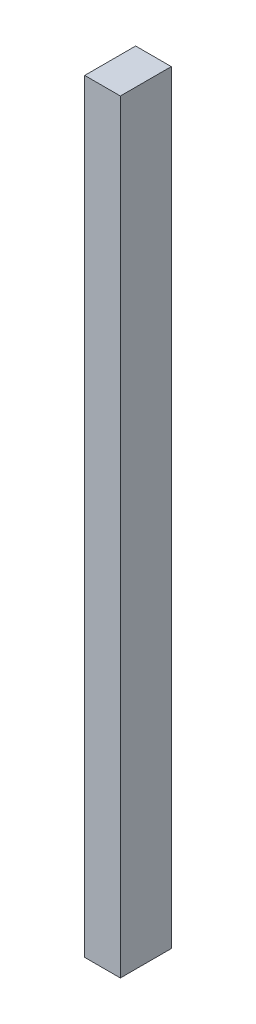
ISO-10303-21;
HEADER;
FILE_DESCRIPTION(('STEP AP214'),'2;1');
FILE_NAME('part.step','',(''),(''),'','','');
FILE_SCHEMA(('AUTOMOTIVE_DESIGN { 1 0 10303 214 1 1 1 1 }'));
ENDSEC;
DATA;
#1=APPLICATION_CONTEXT('core data for automotive mechanical design processes');
#2=APPLICATION_PROTOCOL_DEFINITION('international standard','automotive_design',2000,#1);
#3=PRODUCT_CONTEXT('',#1,'mechanical');
#4=PRODUCT('Part','Part','',(#3));
#5=PRODUCT_RELATED_PRODUCT_CATEGORY('part','',(#4));
#6=PRODUCT_DEFINITION_FORMATION('','',#4);
#7=PRODUCT_DEFINITION_CONTEXT('part definition',#1,'design');
#8=PRODUCT_DEFINITION('design','',#6,#7);
#9=PRODUCT_DEFINITION_SHAPE('','',#8);
#10=(LENGTH_UNIT() NAMED_UNIT(*) SI_UNIT(.MILLI.,.METRE.));
#11=(NAMED_UNIT(*) PLANE_ANGLE_UNIT() SI_UNIT($,.RADIAN.));
#12=(NAMED_UNIT(*) SI_UNIT($,.STERADIAN.) SOLID_ANGLE_UNIT());
#13=UNCERTAINTY_MEASURE_WITH_UNIT(LENGTH_MEASURE(1.E-05),#10,'distance_accuracy_value','');
#14=(GEOMETRIC_REPRESENTATION_CONTEXT(3) GLOBAL_UNCERTAINTY_ASSIGNED_CONTEXT((#13)) GLOBAL_UNIT_ASSIGNED_CONTEXT((#10,
#11,#12)) REPRESENTATION_CONTEXT('',''));
#15=CARTESIAN_POINT('',(0.,0.,0.));
#16=DIRECTION('',(0.,0.,1.));
#17=DIRECTION('',(1.,0.,0.));
#18=AXIS2_PLACEMENT_3D('',#15,#16,#17);
#19=CARTESIAN_POINT('',(0.,0.,0.));
#20=DIRECTION('',(1.,0.,0.));
#21=DIRECTION('',(0.,0.,-1.));
#22=AXIS2_PLACEMENT_3D('',#19,#20,#21);
#23=PLANE('',#22);
#24=DIRECTION('',(0.,1.,0.));
#25=VECTOR('',#24,1.);
#26=CARTESIAN_POINT('',(0.,749.999999999976,-49.9999999999999));
#27=LINE('',#26,#25);
#28=CARTESIAN_POINT('',(0.,-750.000000000024,-50.0000000000001));
#29=VERTEX_POINT('',#28);
#30=CARTESIAN_POINT('',(0.,749.999999999976,-49.9999999999999));
#31=VERTEX_POINT('',#30);
#32=EDGE_CURVE('E143',#29,#31,#27,.T.);
#33=ORIENTED_EDGE('',*,*,#32,.F.);
#34=DIRECTION('',(0.,0.,-1.));
#35=VECTOR('',#34,1.);
#36=CARTESIAN_POINT('',(0.,-750.000000000024,49.9999999999999));
#37=LINE('',#36,#35);
#38=CARTESIAN_POINT('',(0.,-750.000000000024,49.9999999999999));
#39=VERTEX_POINT('',#38);
#40=EDGE_CURVE('E91',#39,#29,#37,.T.);
#41=ORIENTED_EDGE('',*,*,#40,.F.);
#42=DIRECTION('',(0.,-1.,0.));
#43=VECTOR('',#42,1.);
#44=CARTESIAN_POINT('',(0.,749.999999999976,50.0000000000001));
#45=LINE('',#44,#43);
#46=CARTESIAN_POINT('',(0.,749.999999999976,50.0000000000001));
#47=VERTEX_POINT('',#46);
#48=EDGE_CURVE('E168',#47,#39,#45,.T.);
#49=ORIENTED_EDGE('',*,*,#48,.F.);
#50=DIRECTION('',(0.,0.,1.));
#51=VECTOR('',#50,1.);
#52=CARTESIAN_POINT('',(0.,749.999999999976,50.0000000000001));
#53=LINE('',#52,#51);
#54=EDGE_CURVE('E149',#31,#47,#53,.T.);
#55=ORIENTED_EDGE('',*,*,#54,.F.);
#56=EDGE_LOOP('',(#33,#41,#49,#55));
#57=FACE_BOUND('',#56,.T.);
#58=CARTESIAN_POINT('',(0.,500.,1.83903513237663E-13));
#59=DIRECTION('',(1.,0.,0.));
#60=DIRECTION('',(0.,0.,-1.));
#61=AXIS2_PLACEMENT_3D('',#58,#59,#60);
#62=CIRCLE('',#61,19.9999999999998);
#63=CARTESIAN_POINT('',(0.,500.,-19.9999999999996));
#64=VERTEX_POINT('',#63);
#65=CARTESIAN_POINT('',(0.,500.,20.));
#66=VERTEX_POINT('',#65);
#67=EDGE_CURVE('E61',#64,#66,#62,.T.);
#68=ORIENTED_EDGE('',*,*,#67,.T.);
#69=DIRECTION('',(0.,-1.,0.));
#70=VECTOR('',#69,1.);
#71=CARTESIAN_POINT('',(0.,500.,20.));
#72=LINE('',#71,#70);
#73=CARTESIAN_POINT('',(0.,-500.,19.9999999999997));
#74=VERTEX_POINT('',#73);
#75=EDGE_CURVE('E141',#66,#74,#72,.T.);
#76=ORIENTED_EDGE('',*,*,#75,.T.);
#77=CARTESIAN_POINT('',(0.,-500.,-1.22258186549175E-13));
#78=DIRECTION('',(1.,0.,0.));
#79=DIRECTION('',(0.,0.,-1.));
#80=AXIS2_PLACEMENT_3D('',#77,#78,#79);
#81=CIRCLE('',#80,19.9999999999998);
#82=CARTESIAN_POINT('',(0.,-500.,-19.9999999999999));
#83=VERTEX_POINT('',#82);
#84=EDGE_CURVE('E288',#74,#83,#81,.T.);
#85=ORIENTED_EDGE('',*,*,#84,.T.);
#86=DIRECTION('',(0.,1.,0.));
#87=VECTOR('',#86,1.);
#88=CARTESIAN_POINT('',(0.,500.,-19.9999999999996));
#89=LINE('',#88,#87);
#90=EDGE_CURVE('E137',#83,#64,#89,.T.);
#91=ORIENTED_EDGE('',*,*,#90,.T.);
#92=EDGE_LOOP('',(#68,#76,#85,#91));
#93=FACE_BOUND('',#92,.T.);
#94=ADVANCED_FACE('F45',(#57,#93),#23,.F.);
#95=CARTESIAN_POINT('',(70.,749.999999999976,-49.9999999999999));
#96=DIRECTION('',(0.,0.,1.));
#97=DIRECTION('',(0.,-1.,0.));
#98=AXIS2_PLACEMENT_3D('',#95,#96,#97);
#99=PLANE('',#98);
#100=ORIENTED_EDGE('',*,*,#32,.T.);
#101=DIRECTION('',(-1.,0.,0.));
#102=VECTOR('',#101,1.);
#103=CARTESIAN_POINT('',(70.,749.999999999976,-49.9999999999999));
#104=LINE('',#103,#102);
#105=CARTESIAN_POINT('',(70.,749.999999999976,-49.9999999999999));
#106=VERTEX_POINT('',#105);
#107=EDGE_CURVE('E11',#106,#31,#104,.T.);
#108=ORIENTED_EDGE('',*,*,#107,.F.);
#109=DIRECTION('',(0.,1.,0.));
#110=VECTOR('',#109,1.);
#111=CARTESIAN_POINT('',(70.,749.999999999976,-49.9999999999999));
#112=LINE('',#111,#110);
#113=CARTESIAN_POINT('',(70.,-750.000000000024,-50.0000000000001));
#114=VERTEX_POINT('',#113);
#115=EDGE_CURVE('E155',#114,#106,#112,.T.);
#116=ORIENTED_EDGE('',*,*,#115,.F.);
#117=DIRECTION('',(-1.,0.,0.));
#118=VECTOR('',#117,1.);
#119=CARTESIAN_POINT('',(70.,-750.000000000024,-50.0000000000001));
#120=LINE('',#119,#118);
#121=EDGE_CURVE('E164',#114,#29,#120,.T.);
#122=ORIENTED_EDGE('',*,*,#121,.T.);
#123=EDGE_LOOP('',(#100,#108,#116,#122));
#124=FACE_BOUND('',#123,.T.);
#125=ADVANCED_FACE('F47',(#124),#99,.F.);
#126=CARTESIAN_POINT('',(70.,749.999999999976,50.0000000000001));
#127=DIRECTION('',(0.,-1.,0.));
#128=DIRECTION('',(0.,0.,-1.));
#129=AXIS2_PLACEMENT_3D('',#126,#127,#128);
#130=PLANE('',#129);
#131=ORIENTED_EDGE('',*,*,#54,.T.);
#132=DIRECTION('',(-1.,0.,0.));
#133=VECTOR('',#132,1.);
#134=CARTESIAN_POINT('',(70.,749.999999999976,50.0000000000001));
#135=LINE('',#134,#133);
#136=CARTESIAN_POINT('',(70.,749.999999999976,50.0000000000001));
#137=VERTEX_POINT('',#136);
#138=EDGE_CURVE('E54',#137,#47,#135,.T.);
#139=ORIENTED_EDGE('',*,*,#138,.F.);
#140=DIRECTION('',(0.,0.,1.));
#141=VECTOR('',#140,1.);
#142=CARTESIAN_POINT('',(70.,749.999999999976,50.0000000000001));
#143=LINE('',#142,#141);
#144=EDGE_CURVE('E98',#106,#137,#143,.T.);
#145=ORIENTED_EDGE('',*,*,#144,.F.);
#146=ORIENTED_EDGE('',*,*,#107,.T.);
#147=EDGE_LOOP('',(#131,#139,#145,#146));
#148=FACE_BOUND('',#147,.T.);
#149=ADVANCED_FACE('F199',(#148),#130,.F.);
#150=CARTESIAN_POINT('',(70.,749.999999999976,50.0000000000001));
#151=DIRECTION('',(0.,0.,-1.));
#152=DIRECTION('',(0.,1.,0.));
#153=AXIS2_PLACEMENT_3D('',#150,#151,#152);
#154=PLANE('',#153);
#155=ORIENTED_EDGE('',*,*,#48,.T.);
#156=DIRECTION('',(-1.,0.,0.));
#157=VECTOR('',#156,1.);
#158=CARTESIAN_POINT('',(70.,-750.000000000024,49.9999999999999));
#159=LINE('',#158,#157);
#160=CARTESIAN_POINT('',(70.,-750.000000000024,49.9999999999999));
#161=VERTEX_POINT('',#160);
#162=EDGE_CURVE('E175',#161,#39,#159,.T.);
#163=ORIENTED_EDGE('',*,*,#162,.F.);
#164=DIRECTION('',(0.,-1.,0.));
#165=VECTOR('',#164,1.);
#166=CARTESIAN_POINT('',(70.,749.999999999976,50.0000000000001));
#167=LINE('',#166,#165);
#168=EDGE_CURVE('E160',#137,#161,#167,.T.);
#169=ORIENTED_EDGE('',*,*,#168,.F.);
#170=ORIENTED_EDGE('',*,*,#138,.T.);
#171=EDGE_LOOP('',(#155,#163,#169,#170));
#172=FACE_BOUND('',#171,.T.);
#173=ADVANCED_FACE('F182',(#172),#154,.F.);
#174=CARTESIAN_POINT('',(70.,-750.000000000024,49.9999999999999));
#175=DIRECTION('',(0.,1.,0.));
#176=DIRECTION('',(0.,0.,1.));
#177=AXIS2_PLACEMENT_3D('',#174,#175,#176);
#178=PLANE('',#177);
#179=ORIENTED_EDGE('',*,*,#40,.T.);
#180=ORIENTED_EDGE('',*,*,#121,.F.);
#181=DIRECTION('',(0.,0.,-1.));
#182=VECTOR('',#181,1.);
#183=CARTESIAN_POINT('',(70.,-750.000000000024,49.9999999999999));
#184=LINE('',#183,#182);
#185=EDGE_CURVE('E70',#161,#114,#184,.T.);
#186=ORIENTED_EDGE('',*,*,#185,.F.);
#187=ORIENTED_EDGE('',*,*,#162,.T.);
#188=EDGE_LOOP('',(#179,#180,#186,#187));
#189=FACE_BOUND('',#188,.T.);
#190=ADVANCED_FACE('F190',(#189),#178,.F.);
#191=CARTESIAN_POINT('',(70.,0.,0.));
#192=DIRECTION('',(1.,0.,0.));
#193=DIRECTION('',(0.,0.,-1.));
#194=AXIS2_PLACEMENT_3D('',#191,#192,#193);
#195=PLANE('',#194);
#196=ORIENTED_EDGE('',*,*,#115,.T.);
#197=ORIENTED_EDGE('',*,*,#144,.T.);
#198=ORIENTED_EDGE('',*,*,#168,.T.);
#199=ORIENTED_EDGE('',*,*,#185,.T.);
#200=EDGE_LOOP('',(#196,#197,#198,#199));
#201=FACE_BOUND('',#200,.T.);
#202=ADVANCED_FACE('F192',(#201),#195,.T.);
#203=CARTESIAN_POINT('',(50.,500.,1.83903513237663E-13));
#204=DIRECTION('',(-1.,0.,0.));
#205=DIRECTION('',(0.,0.,1.));
#206=AXIS2_PLACEMENT_3D('',#203,#204,#205);
#207=CYLINDRICAL_SURFACE('',#206,19.9999999999998);
#208=ORIENTED_EDGE('',*,*,#67,.F.);
#209=DIRECTION('',(-1.,0.,0.));
#210=VECTOR('',#209,1.);
#211=CARTESIAN_POINT('',(50.,500.,-19.9999999999996));
#212=LINE('',#211,#210);
#213=CARTESIAN_POINT('',(50.,500.,-19.9999999999996));
#214=VERTEX_POINT('',#213);
#215=EDGE_CURVE('E135',#214,#64,#212,.T.);
#216=ORIENTED_EDGE('',*,*,#215,.F.);
#217=CARTESIAN_POINT('',(50.,500.,1.83903513237663E-13));
#218=DIRECTION('',(1.,0.,0.));
#219=DIRECTION('',(0.,0.,-1.));
#220=AXIS2_PLACEMENT_3D('',#217,#218,#219);
#221=CIRCLE('',#220,19.9999999999998);
#222=CARTESIAN_POINT('',(50.,500.,20.));
#223=VERTEX_POINT('',#222);
#224=EDGE_CURVE('E126',#214,#223,#221,.T.);
#225=ORIENTED_EDGE('',*,*,#224,.T.);
#226=DIRECTION('',(-1.,0.,0.));
#227=VECTOR('',#226,1.);
#228=CARTESIAN_POINT('',(50.,500.,20.));
#229=LINE('',#228,#227);
#230=EDGE_CURVE('E134',#223,#66,#229,.T.);
#231=ORIENTED_EDGE('',*,*,#230,.T.);
#232=EDGE_LOOP('',(#208,#216,#225,#231));
#233=FACE_BOUND('',#232,.T.);
#234=ADVANCED_FACE('F133',(#233),#207,.F.);
#235=CARTESIAN_POINT('',(50.,500.,20.));
#236=DIRECTION('',(0.,0.,-1.));
#237=DIRECTION('',(0.,1.,0.));
#238=AXIS2_PLACEMENT_3D('',#235,#236,#237);
#239=PLANE('',#238);
#240=ORIENTED_EDGE('',*,*,#75,.F.);
#241=ORIENTED_EDGE('',*,*,#230,.F.);
#242=DIRECTION('',(0.,-1.,0.));
#243=VECTOR('',#242,1.);
#244=CARTESIAN_POINT('',(50.,500.,20.));
#245=LINE('',#244,#243);
#246=CARTESIAN_POINT('',(50.,-500.,19.9999999999997));
#247=VERTEX_POINT('',#246);
#248=EDGE_CURVE('E122',#223,#247,#245,.T.);
#249=ORIENTED_EDGE('',*,*,#248,.T.);
#250=DIRECTION('',(-1.,0.,0.));
#251=VECTOR('',#250,1.);
#252=CARTESIAN_POINT('',(50.,-500.,19.9999999999997));
#253=LINE('',#252,#251);
#254=EDGE_CURVE('E144',#247,#74,#253,.T.);
#255=ORIENTED_EDGE('',*,*,#254,.T.);
#256=EDGE_LOOP('',(#240,#241,#249,#255));
#257=FACE_BOUND('',#256,.T.);
#258=ADVANCED_FACE('F139',(#257),#239,.T.);
#259=CARTESIAN_POINT('',(50.,-500.,-1.22258186549175E-13));
#260=DIRECTION('',(-1.,0.,0.));
#261=DIRECTION('',(0.,0.,1.));
#262=AXIS2_PLACEMENT_3D('',#259,#260,#261);
#263=CYLINDRICAL_SURFACE('',#262,19.9999999999998);
#264=ORIENTED_EDGE('',*,*,#84,.F.);
#265=ORIENTED_EDGE('',*,*,#254,.F.);
#266=CARTESIAN_POINT('',(50.,-500.,-1.22258186549175E-13));
#267=DIRECTION('',(1.,0.,0.));
#268=DIRECTION('',(0.,0.,-1.));
#269=AXIS2_PLACEMENT_3D('',#266,#267,#268);
#270=CIRCLE('',#269,19.9999999999998);
#271=CARTESIAN_POINT('',(50.,-500.,-19.9999999999999));
#272=VERTEX_POINT('',#271);
#273=EDGE_CURVE('E127',#247,#272,#270,.T.);
#274=ORIENTED_EDGE('',*,*,#273,.T.);
#275=DIRECTION('',(-1.,0.,0.));
#276=VECTOR('',#275,1.);
#277=CARTESIAN_POINT('',(50.,-500.,-19.9999999999999));
#278=LINE('',#277,#276);
#279=EDGE_CURVE('E151',#272,#83,#278,.T.);
#280=ORIENTED_EDGE('',*,*,#279,.T.);
#281=EDGE_LOOP('',(#264,#265,#274,#280));
#282=FACE_BOUND('',#281,.T.);
#283=ADVANCED_FACE('F211',(#282),#263,.F.);
#284=CARTESIAN_POINT('',(50.,500.,-19.9999999999996));
#285=DIRECTION('',(0.,0.,1.));
#286=DIRECTION('',(0.,-1.,0.));
#287=AXIS2_PLACEMENT_3D('',#284,#285,#286);
#288=PLANE('',#287);
#289=ORIENTED_EDGE('',*,*,#90,.F.);
#290=ORIENTED_EDGE('',*,*,#279,.F.);
#291=DIRECTION('',(0.,1.,0.));
#292=VECTOR('',#291,1.);
#293=CARTESIAN_POINT('',(50.,500.,-19.9999999999996));
#294=LINE('',#293,#292);
#295=EDGE_CURVE('E298',#272,#214,#294,.T.);
#296=ORIENTED_EDGE('',*,*,#295,.T.);
#297=ORIENTED_EDGE('',*,*,#215,.T.);
#298=EDGE_LOOP('',(#289,#290,#296,#297));
#299=FACE_BOUND('',#298,.T.);
#300=ADVANCED_FACE('F214',(#299),#288,.T.);
#301=CARTESIAN_POINT('',(50.,500.,1.83903513237663E-13));
#302=DIRECTION('',(1.,0.,0.));
#303=DIRECTION('',(0.,0.,-1.));
#304=AXIS2_PLACEMENT_3D('',#301,#302,#303);
#305=PLANE('',#304);
#306=ORIENTED_EDGE('',*,*,#224,.F.);
#307=ORIENTED_EDGE('',*,*,#295,.F.);
#308=ORIENTED_EDGE('',*,*,#273,.F.);
#309=ORIENTED_EDGE('',*,*,#248,.F.);
#310=EDGE_LOOP('',(#306,#307,#308,#309));
#311=FACE_BOUND('',#310,.T.);
#312=ADVANCED_FACE('F124',(#311),#305,.F.);
#313=CLOSED_SHELL('',(#94,#125,#149,#173,#190,#202,#234,#258,#283,#300,#312));
#314=MANIFOLD_SOLID_BREP('B2',#313);
#315=ADVANCED_BREP_SHAPE_REPRESENTATION('',(#18,#314),#14);
#316=SHAPE_DEFINITION_REPRESENTATION(#9,#315);
ENDSEC;
END-ISO-10303-21;
